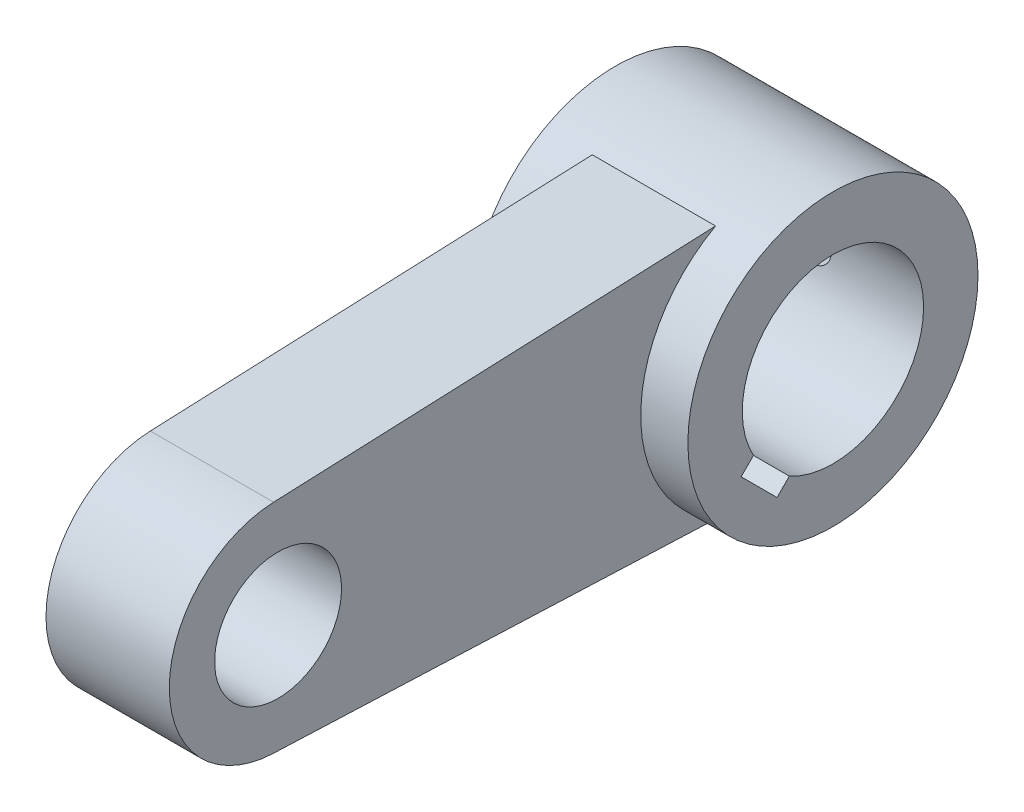
ISO-10303-21;
HEADER;
FILE_DESCRIPTION(('STEP AP214'),'2;1');
FILE_NAME('part.step','',(''),(''),'','','');
FILE_SCHEMA(('AUTOMOTIVE_DESIGN { 1 0 10303 214 1 1 1 1 }'));
ENDSEC;
DATA;
#1=APPLICATION_CONTEXT('core data for automotive mechanical design processes');
#2=APPLICATION_PROTOCOL_DEFINITION('international standard','automotive_design',2000,#1);
#3=PRODUCT_CONTEXT('',#1,'mechanical');
#4=PRODUCT('Part','Part','',(#3));
#5=PRODUCT_RELATED_PRODUCT_CATEGORY('part','',(#4));
#6=PRODUCT_DEFINITION_FORMATION('','',#4);
#7=PRODUCT_DEFINITION_CONTEXT('part definition',#1,'design');
#8=PRODUCT_DEFINITION('design','',#6,#7);
#9=PRODUCT_DEFINITION_SHAPE('','',#8);
#10=(LENGTH_UNIT() NAMED_UNIT(*) SI_UNIT(.MILLI.,.METRE.));
#11=(NAMED_UNIT(*) PLANE_ANGLE_UNIT() SI_UNIT($,.RADIAN.));
#12=(NAMED_UNIT(*) SI_UNIT($,.STERADIAN.) SOLID_ANGLE_UNIT());
#13=UNCERTAINTY_MEASURE_WITH_UNIT(LENGTH_MEASURE(1.E-05),#10,'distance_accuracy_value','');
#14=(GEOMETRIC_REPRESENTATION_CONTEXT(3) GLOBAL_UNCERTAINTY_ASSIGNED_CONTEXT((#13)) GLOBAL_UNIT_ASSIGNED_CONTEXT((#10,
#11,#12)) REPRESENTATION_CONTEXT('',''));
#15=CARTESIAN_POINT('',(0.,0.,0.));
#16=DIRECTION('',(0.,0.,1.));
#17=DIRECTION('',(1.,0.,0.));
#18=AXIS2_PLACEMENT_3D('',#15,#16,#17);
#19=CARTESIAN_POINT('',(30.,0.,0.));
#20=DIRECTION('',(-1.,0.,0.));
#21=DIRECTION('',(0.,0.,1.));
#22=AXIS2_PLACEMENT_3D('',#19,#20,#21);
#23=CYLINDRICAL_SURFACE('',#22,25.);
#24=DIRECTION('',(-1.,0.,0.));
#25=VECTOR('',#24,1.);
#26=CARTESIAN_POINT('',(30.,-21.920310216783,12.0208152801713));
#27=LINE('',#26,#25);
#28=CARTESIAN_POINT('',(30.,-21.920310216783,12.0208152801713));
#29=VERTEX_POINT('',#28);
#30=CARTESIAN_POINT('',(-30.,-21.920310216783,12.0208152801713));
#31=VERTEX_POINT('',#30);
#32=EDGE_CURVE('E11',#29,#31,#27,.T.);
#33=ORIENTED_EDGE('',*,*,#32,.F.);
#34=CARTESIAN_POINT('',(30.,0.,0.));
#35=DIRECTION('',(1.,0.,0.));
#36=DIRECTION('',(0.,0.,-1.));
#37=AXIS2_PLACEMENT_3D('',#34,#35,#36);
#38=CIRCLE('',#37,25.);
#39=CARTESIAN_POINT('',(30.,-12.0208152801714,21.920310216783));
#40=VERTEX_POINT('',#39);
#41=EDGE_CURVE('E194',#29,#40,#38,.T.);
#42=ORIENTED_EDGE('',*,*,#41,.T.);
#43=DIRECTION('',(-1.,0.,0.));
#44=VECTOR('',#43,1.);
#45=CARTESIAN_POINT('',(30.,-12.0208152801714,21.920310216783));
#46=LINE('',#45,#44);
#47=CARTESIAN_POINT('',(-30.,-12.0208152801714,21.9203102167829));
#48=VERTEX_POINT('',#47);
#49=EDGE_CURVE('E54',#48,#40,#46,.F.);
#50=ORIENTED_EDGE('',*,*,#49,.F.);
#51=CARTESIAN_POINT('',(-30.,0.,0.));
#52=DIRECTION('',(1.,0.,0.));
#53=DIRECTION('',(0.,0.,-1.));
#54=AXIS2_PLACEMENT_3D('',#51,#52,#53);
#55=CIRCLE('',#54,25.);
#56=EDGE_CURVE('E131',#31,#48,#55,.T.);
#57=ORIENTED_EDGE('',*,*,#56,.F.);
#58=EDGE_LOOP('',(#33,#42,#50,#57));
#59=FACE_BOUND('',#58,.T.);
#60=CARTESIAN_POINT('',(-4.5,0.,-25.));
#61=CARTESIAN_POINT('',(-4.49999023794724,0.250597363973599,-24.9999955349824));
#62=CARTESIAN_POINT('',(-4.47899625537845,0.501323876917189,-24.9961930246658));
#63=CARTESIAN_POINT('',(-4.39562192968987,0.995723957330813,-24.9813904308185));
#64=CARTESIAN_POINT('',(-4.3332054899993,1.23939117970386,-24.9703840697862));
#65=CARTESIAN_POINT('',(-4.16894916310287,1.71244999616223,-24.9424062116718));
#66=CARTESIAN_POINT('',(-4.06714363575236,1.9418538305925,-24.9254399147403));
#67=CARTESIAN_POINT('',(-3.82709380352833,2.38030017518678,-24.8873996423389));
#68=CARTESIAN_POINT('',(-3.68885289902246,2.58934458292246,-24.8663260502343));
#69=CARTESIAN_POINT('',(-3.3782296875251,2.98347784104024,-24.8221399679868));
#70=CARTESIAN_POINT('',(-3.20552232290177,3.16830850004194,-24.7990093268507));
#71=CARTESIAN_POINT('',(-2.83156816138721,3.50653520488897,-24.7534523836025));
#72=CARTESIAN_POINT('',(-2.63031941200501,3.65992909841612,-24.7310261298053));
#73=CARTESIAN_POINT('',(-2.20318937983302,3.9319873899253,-24.6892410288132));
#74=CARTESIAN_POINT('',(-1.97714004226101,4.0503918562218,-24.6699056064479));
#75=CARTESIAN_POINT('',(-1.50795273724954,4.24744691783923,-24.6367457883014));
#76=CARTESIAN_POINT('',(-1.26481612489624,4.32610066150121,-24.6229209560882));
#77=CARTESIAN_POINT('',(-0.771109385193302,4.44059853206701,-24.6025296249144));
#78=CARTESIAN_POINT('',(-0.520646504029352,4.47689129643564,-24.595887115759));
#79=CARTESIAN_POINT('',(-0.0171050046733867,4.50702896793618,-24.5903830912277));
#80=CARTESIAN_POINT('',(0.235973395787884,4.50087738040681,-24.5915209332983));
#81=CARTESIAN_POINT('',(0.734329570898184,4.44666536597975,-24.6013797705314));
#82=CARTESIAN_POINT('',(0.979664673316094,4.39911277131185,-24.6100088728769));
#83=CARTESIAN_POINT('',(1.45881687055287,4.26424730205573,-24.63373379911));
#84=CARTESIAN_POINT('',(1.69263351048955,4.17693285860231,-24.6488298781609));
#85=CARTESIAN_POINT('',(2.14361028624316,3.9645188236012,-24.6838850704582));
#86=CARTESIAN_POINT('',(2.36067067050962,3.83921201164645,-24.7038707343535));
#87=CARTESIAN_POINT('',(2.77087600628489,3.55451700057605,-24.7464353447752));
#88=CARTESIAN_POINT('',(2.96401871256649,3.39512560565797,-24.7690145343811));
#89=CARTESIAN_POINT('',(3.32384227379376,3.04403715860642,-24.8146237678444));
#90=CARTESIAN_POINT('',(3.49009887265454,2.85190522880331,-24.8376556021255));
#91=CARTESIAN_POINT('',(3.78808180669696,2.44225060557958,-24.881273529755));
#92=CARTESIAN_POINT('',(3.91980784519208,2.2247276940229,-24.9018596020886));
#93=CARTESIAN_POINT('',(4.14504397125817,1.77003953774169,-24.9383032656858));
#94=CARTESIAN_POINT('',(4.23851241690939,1.53285322593544,-24.9541556995184));
#95=CARTESIAN_POINT('',(4.38416438602457,1.04579850607947,-24.9793055791382));
#96=CARTESIAN_POINT('',(4.43635194625771,0.795931340606712,-24.9886036658512));
#97=CARTESIAN_POINT('',(4.49737595980626,0.294260216988702,-24.9995098648126));
#98=CARTESIAN_POINT('',(4.50679412042045,0.0425291868626924,-25.0012211575048));
#99=CARTESIAN_POINT('',(4.48356880794404,-0.458911723409039,-24.9970450682725));
#100=CARTESIAN_POINT('',(4.45092723320147,-0.708621694262525,-24.9911580292954));
#101=CARTESIAN_POINT('',(4.3449927666636,-1.19710504925386,-24.9725108511794));
#102=CARTESIAN_POINT('',(4.27199185315769,-1.43594380194823,-24.9598000968948));
#103=CARTESIAN_POINT('',(4.08772514305909,-1.8979925718465,-24.9289247642723));
#104=CARTESIAN_POINT('',(3.97645691054883,-2.12120159304627,-24.9107598387568));
#105=CARTESIAN_POINT('',(3.71750990184803,-2.54815393884932,-24.8707339593877));
#106=CARTESIAN_POINT('',(3.56947271887178,-2.75167647822448,-24.8488373327329));
#107=CARTESIAN_POINT('',(3.24167799765414,-3.13119917221303,-24.8038743164273));
#108=CARTESIAN_POINT('',(3.06191774493283,-3.30719696915623,-24.7808078267941));
#109=CARTESIAN_POINT('',(2.67315500182631,-3.62886457227507,-24.7357657200145));
#110=CARTESIAN_POINT('',(2.46382297755346,-3.77413883025331,-24.7138068137446));
#111=CARTESIAN_POINT('',(2.0233846981458,-4.02746147197305,-24.6737931763475));
#112=CARTESIAN_POINT('',(1.79227921149041,-4.1355111689036,-24.6557383075041));
#113=CARTESIAN_POINT('',(1.31589632776009,-4.31074517708663,-24.625706003715));
#114=CARTESIAN_POINT('',(1.07068958451153,-4.37811658335141,-24.6137007869683));
#115=CARTESIAN_POINT('',(0.572202641973279,-4.470663283678,-24.5970611969283));
#116=CARTESIAN_POINT('',(0.318923277225497,-4.4958429251693,-24.5924260642259));
#117=CARTESIAN_POINT('',(-0.184561947418673,-4.50315482559001,-24.5910878378625));
#118=CARTESIAN_POINT('',(-0.434758663309364,-4.48591048444909,-24.5942698737029));
#119=CARTESIAN_POINT('',(-0.928626221595354,-4.41022247631822,-24.6079538411193));
#120=CARTESIAN_POINT('',(-1.17229709592797,-4.35177901099412,-24.6184557368654));
#121=CARTESIAN_POINT('',(-1.64589578423665,-4.19560591177254,-24.6455494917391));
#122=CARTESIAN_POINT('',(-1.87584475423245,-4.09793864892305,-24.662131678772));
#123=CARTESIAN_POINT('',(-2.31619323333666,-3.86615687487561,-24.6995253290601));
#124=CARTESIAN_POINT('',(-2.52659151135305,-3.73204007056229,-24.7203370583837));
#125=CARTESIAN_POINT('',(-2.92499910875623,-3.42897741944008,-24.7642042764878));
#126=CARTESIAN_POINT('',(-3.1126589480834,-3.2595759827768,-24.7872867920529));
#127=CARTESIAN_POINT('',(-3.45709859905684,-2.89170727952952,-24.8328876755423));
#128=CARTESIAN_POINT('',(-3.61387129988846,-2.69323333818786,-24.8554059125196));
#129=CARTESIAN_POINT('',(-3.89327881529926,-2.27090824238867,-24.8975568201724));
#130=CARTESIAN_POINT('',(-4.01562311176295,-2.04686231241926,-24.9171643109947));
#131=CARTESIAN_POINT('',(-4.22074281003121,-1.58112288437946,-24.951039224399));
#132=CARTESIAN_POINT('',(-4.30355622072278,-1.33944659673402,-24.9653117736424));
#133=CARTESIAN_POINT('',(-4.41001277594757,-0.914142661867406,-24.9839218868527));
#134=CARTESIAN_POINT('',(-4.44370168771491,-0.733035393798855,-24.9899178167023));
#135=CARTESIAN_POINT('',(-4.48869863631085,-0.367975256206721,-24.9979584689488));
#136=CARTESIAN_POINT('',(-4.50000716861835,-0.184022449771341,-25.0000032788193));
#137=CARTESIAN_POINT('',(-4.5,0.,-25.));
#138=B_SPLINE_CURVE_WITH_KNOTS('',3,(#60,#61,#62,#63,#64,#65,#66,#67,#68,#69,#70,#71,#72,#73,
#74,#75,#76,#77,#78,#79,#80,#81,#82,#83,#84,#85,#86,#87,#88,#89,#90,#91,#92,#93,#94,#95,#96,#97,
#98,#99,#100,#101,#102,#103,#104,#105,#106,#107,#108,#109,#110,#111,#112,#113,#114,#115,#116,
#117,#118,#119,#120,#121,#122,#123,#124,#125,#126,#127,#128,#129,#130,#131,#132,#133,#134,#135,
#136,#137),.UNSPECIFIED.,.T.,.F.,(4,2,2,2,2,2,2,2,2,2,2,2,2,2,2,2,2,2,2,2,2,2,2,2,2,2,2,2,2,2,2,
2,2,2,2,2,2,2,4),(0.,0.751119234214512,1.50289387360229,2.25401419876758,3.00506444969103,
3.76356460982702,4.52211668334152,5.28616990310778,6.05016259876061,6.80598838145023,
7.56175174373442,8.30837334117056,9.05502440026869,9.80582347634745,10.5566929789408,
11.3184489414851,12.0802114488208,12.8428009144685,13.6053157989071,14.3574280220778,
15.1095063001765,15.8562135718353,16.6029683841676,17.3573093811478,18.1117149569104,
18.8753101422374,19.6388783870845,20.3989073934055,21.1588580817001,21.9077085429232,
22.6565553386193,23.4042160535922,24.1519238163261,24.9099617237503,25.6681739427107,
26.4326044530477,27.1962984767,27.7478839346366,28.2994571808942),.UNSPECIFIED.);
#139=CARTESIAN_POINT('',(-4.5,0.,-25.));
#140=VERTEX_POINT('',#139);
#141=EDGE_CURVE('E43',#140,#140,#138,.T.);
#142=ORIENTED_EDGE('',*,*,#141,.T.);
#143=EDGE_LOOP('',(#142));
#144=FACE_BOUND('',#143,.T.);
#145=ADVANCED_FACE('F39',(#59,#144),#23,.F.);
#146=CARTESIAN_POINT('',(30.,0.,0.));
#147=DIRECTION('',(1.,0.,0.));
#148=DIRECTION('',(0.,0.,-1.));
#149=AXIS2_PLACEMENT_3D('',#146,#147,#148);
#150=PLANE('',#149);
#151=DIRECTION('',(0.,0.707106781186549,-0.707106781186546));
#152=VECTOR('',#151,1.);
#153=CARTESIAN_POINT('',(30.,-3.70285616152566,-6.19663877508598));
#154=LINE('',#153,#152);
#155=CARTESIAN_POINT('',(30.,-25.3144227664784,15.4149278298667));
#156=VERTEX_POINT('',#155);
#157=EDGE_CURVE('E133',#156,#29,#154,.T.);
#158=ORIENTED_EDGE('',*,*,#157,.F.);
#159=DIRECTION('',(0.,-0.707106781186546,-0.707106781186549));
#160=VECTOR('',#159,1.);
#161=CARTESIAN_POINT('',(30.,-15.4149278298668,25.3144227664784));
#162=LINE('',#161,#160);
#163=CARTESIAN_POINT('',(30.,-15.4149278298668,25.3144227664784));
#164=VERTEX_POINT('',#163);
#165=EDGE_CURVE('E136',#164,#156,#162,.T.);
#166=ORIENTED_EDGE('',*,*,#165,.F.);
#167=DIRECTION('',(0.,-0.707106781186549,0.707106781186546));
#168=VECTOR('',#167,1.);
#169=CARTESIAN_POINT('',(30.,6.19663877508597,3.70285616152568));
#170=LINE('',#169,#168);
#171=EDGE_CURVE('E112',#40,#164,#170,.T.);
#172=ORIENTED_EDGE('',*,*,#171,.F.);
#173=ORIENTED_EDGE('',*,*,#41,.F.);
#174=EDGE_LOOP('',(#158,#166,#172,#173));
#175=FACE_BOUND('',#174,.T.);
#176=CARTESIAN_POINT('',(30.,0.,0.));
#177=DIRECTION('',(1.,0.,0.));
#178=DIRECTION('',(0.,0.,-1.));
#179=AXIS2_PLACEMENT_3D('',#176,#177,#178);
#180=CIRCLE('',#179,40.);
#181=CARTESIAN_POINT('',(30.,0.,-40.));
#182=VERTEX_POINT('',#181);
#183=EDGE_CURVE('E201',#182,#182,#180,.T.);
#184=ORIENTED_EDGE('',*,*,#183,.T.);
#185=EDGE_LOOP('',(#184));
#186=FACE_BOUND('',#185,.T.);
#187=ADVANCED_FACE('F216',(#175,#186),#150,.T.);
#188=CARTESIAN_POINT('',(-30.,0.,0.));
#189=DIRECTION('',(1.,0.,0.));
#190=DIRECTION('',(0.,0.,-1.));
#191=AXIS2_PLACEMENT_3D('',#188,#189,#190);
#192=PLANE('',#191);
#193=CARTESIAN_POINT('',(-30.,0.,0.));
#194=DIRECTION('',(1.,0.,0.));
#195=DIRECTION('',(0.,0.,-1.));
#196=AXIS2_PLACEMENT_3D('',#193,#194,#195);
#197=CIRCLE('',#196,40.);
#198=CARTESIAN_POINT('',(-30.,0.,-40.));
#199=VERTEX_POINT('',#198);
#200=EDGE_CURVE('E198',#199,#199,#197,.T.);
#201=ORIENTED_EDGE('',*,*,#200,.F.);
#202=EDGE_LOOP('',(#201));
#203=FACE_BOUND('',#202,.T.);
#204=DIRECTION('',(0.,-0.707106781186546,-0.707106781186549));
#205=VECTOR('',#204,1.);
#206=CARTESIAN_POINT('',(-30.,-15.4149278298668,25.3144227664784));
#207=LINE('',#206,#205);
#208=CARTESIAN_POINT('',(-30.,-15.4149278298668,25.3144227664784));
#209=VERTEX_POINT('',#208);
#210=CARTESIAN_POINT('',(-30.,-25.3144227664784,15.4149278298667));
#211=VERTEX_POINT('',#210);
#212=EDGE_CURVE('E121',#209,#211,#207,.T.);
#213=ORIENTED_EDGE('',*,*,#212,.T.);
#214=DIRECTION('',(0.,0.707106781186549,-0.707106781186546));
#215=VECTOR('',#214,1.);
#216=CARTESIAN_POINT('',(-30.,-3.70285616152566,-6.19663877508598));
#217=LINE('',#216,#215);
#218=EDGE_CURVE('E118',#211,#31,#217,.T.);
#219=ORIENTED_EDGE('',*,*,#218,.T.);
#220=ORIENTED_EDGE('',*,*,#56,.T.);
#221=DIRECTION('',(0.,-0.707106781186549,0.707106781186546));
#222=VECTOR('',#221,1.);
#223=CARTESIAN_POINT('',(-30.,6.19663877508597,3.70285616152568));
#224=LINE('',#223,#222);
#225=EDGE_CURVE('E61',#48,#209,#224,.T.);
#226=ORIENTED_EDGE('',*,*,#225,.T.);
#227=EDGE_LOOP('',(#213,#219,#220,#226));
#228=FACE_BOUND('',#227,.T.);
#229=ADVANCED_FACE('F129',(#203,#228),#192,.F.);
#230=CARTESIAN_POINT('',(30.,0.,0.));
#231=DIRECTION('',(-1.,0.,0.));
#232=DIRECTION('',(0.,0.,1.));
#233=AXIS2_PLACEMENT_3D('',#230,#231,#232);
#234=CYLINDRICAL_SURFACE('',#233,40.);
#235=DIRECTION('',(-1.,0.,0.));
#236=VECTOR('',#235,1.);
#237=CARTESIAN_POINT('',(17.,35.,19.3649167310371));
#238=LINE('',#237,#236);
#239=CARTESIAN_POINT('',(17.,35.,19.3649167310371));
#240=VERTEX_POINT('',#239);
#241=CARTESIAN_POINT('',(-17.,35.,19.3649167310371));
#242=VERTEX_POINT('',#241);
#243=EDGE_CURVE('E69',#240,#242,#238,.T.);
#244=ORIENTED_EDGE('',*,*,#243,.F.);
#245=CARTESIAN_POINT('',(17.,0.,0.));
#246=DIRECTION('',(-1.,0.,0.));
#247=DIRECTION('',(0.,0.,-1.));
#248=AXIS2_PLACEMENT_3D('',#245,#246,#247);
#249=CIRCLE('',#248,40.);
#250=CARTESIAN_POINT('',(17.,-35.,19.3649167310371));
#251=VERTEX_POINT('',#250);
#252=EDGE_CURVE('E154',#251,#240,#249,.T.);
#253=ORIENTED_EDGE('',*,*,#252,.F.);
#254=DIRECTION('',(-1.,0.,0.));
#255=VECTOR('',#254,1.);
#256=CARTESIAN_POINT('',(17.,-35.,19.3649167310371));
#257=LINE('',#256,#255);
#258=CARTESIAN_POINT('',(-17.,-35.,19.3649167310371));
#259=VERTEX_POINT('',#258);
#260=EDGE_CURVE('E169',#251,#259,#257,.T.);
#261=ORIENTED_EDGE('',*,*,#260,.T.);
#262=CARTESIAN_POINT('',(-17.,0.,0.));
#263=DIRECTION('',(-1.,0.,0.));
#264=DIRECTION('',(0.,0.,-1.));
#265=AXIS2_PLACEMENT_3D('',#262,#263,#264);
#266=CIRCLE('',#265,40.);
#267=EDGE_CURVE('E170',#259,#242,#266,.T.);
#268=ORIENTED_EDGE('',*,*,#267,.T.);
#269=EDGE_LOOP('',(#244,#253,#261,#268));
#270=FACE_BOUND('',#269,.T.);
#271=ORIENTED_EDGE('',*,*,#183,.F.);
#272=EDGE_LOOP('',(#271));
#273=FACE_BOUND('',#272,.T.);
#274=ORIENTED_EDGE('',*,*,#200,.T.);
#275=EDGE_LOOP('',(#274));
#276=FACE_BOUND('',#275,.T.);
#277=ADVANCED_FACE('F41',(#270,#273,#276),#234,.T.);
#278=CARTESIAN_POINT('',(17.,35.,19.3649167310371));
#279=DIRECTION('',(0.,-0.999150880094501,-0.04120095637706));
#280=DIRECTION('',(0.,0.04120095637706,-0.999150880094501));
#281=AXIS2_PLACEMENT_3D('',#278,#279,#280);
#282=PLANE('',#281);
#283=DIRECTION('',(0.,-0.04120095637706,0.999150880094501));
#284=VECTOR('',#283,1.);
#285=CARTESIAN_POINT('',(-17.,35.,19.3649167310371));
#286=LINE('',#285,#284);
#287=CARTESIAN_POINT('',(-17.,29.974526402835,141.236028691312));
#288=VERTEX_POINT('',#287);
#289=EDGE_CURVE('E173',#242,#288,#286,.T.);
#290=ORIENTED_EDGE('',*,*,#289,.T.);
#291=DIRECTION('',(-1.,0.,0.));
#292=VECTOR('',#291,1.);
#293=CARTESIAN_POINT('',(17.,29.974526402835,141.236028691312));
#294=LINE('',#293,#292);
#295=CARTESIAN_POINT('',(17.,29.974526402835,141.236028691312));
#296=VERTEX_POINT('',#295);
#297=EDGE_CURVE('E188',#296,#288,#294,.T.);
#298=ORIENTED_EDGE('',*,*,#297,.F.);
#299=DIRECTION('',(0.,-0.04120095637706,0.999150880094501));
#300=VECTOR('',#299,1.);
#301=CARTESIAN_POINT('',(17.,35.,19.3649167310371));
#302=LINE('',#301,#300);
#303=EDGE_CURVE('E158',#240,#296,#302,.T.);
#304=ORIENTED_EDGE('',*,*,#303,.F.);
#305=ORIENTED_EDGE('',*,*,#243,.T.);
#306=EDGE_LOOP('',(#290,#298,#304,#305));
#307=FACE_BOUND('',#306,.T.);
#308=ADVANCED_FACE('F240',(#307),#282,.F.);
#309=CARTESIAN_POINT('',(17.,0.,140.));
#310=DIRECTION('',(-1.,0.,0.));
#311=DIRECTION('',(0.,0.,1.));
#312=AXIS2_PLACEMENT_3D('',#309,#310,#311);
#313=CYLINDRICAL_SURFACE('',#312,30.);
#314=CARTESIAN_POINT('',(-17.,0.,140.));
#315=DIRECTION('',(1.,0.,0.));
#316=DIRECTION('',(0.,0.,-1.));
#317=AXIS2_PLACEMENT_3D('',#314,#315,#316);
#318=CIRCLE('',#317,30.);
#319=CARTESIAN_POINT('',(-17.,-29.974526402835,141.236028691312));
#320=VERTEX_POINT('',#319);
#321=EDGE_CURVE('E176',#288,#320,#318,.T.);
#322=ORIENTED_EDGE('',*,*,#321,.T.);
#323=DIRECTION('',(-1.,0.,0.));
#324=VECTOR('',#323,1.);
#325=CARTESIAN_POINT('',(17.,-29.974526402835,141.236028691312));
#326=LINE('',#325,#324);
#327=CARTESIAN_POINT('',(17.,-29.974526402835,141.236028691312));
#328=VERTEX_POINT('',#327);
#329=EDGE_CURVE('E184',#328,#320,#326,.T.);
#330=ORIENTED_EDGE('',*,*,#329,.F.);
#331=CARTESIAN_POINT('',(17.,0.,140.));
#332=DIRECTION('',(1.,0.,0.));
#333=DIRECTION('',(0.,0.,-1.));
#334=AXIS2_PLACEMENT_3D('',#331,#332,#333);
#335=CIRCLE('',#334,30.);
#336=EDGE_CURVE('E162',#296,#328,#335,.T.);
#337=ORIENTED_EDGE('',*,*,#336,.F.);
#338=ORIENTED_EDGE('',*,*,#297,.T.);
#339=EDGE_LOOP('',(#322,#330,#337,#338));
#340=FACE_BOUND('',#339,.T.);
#341=ADVANCED_FACE('F252',(#340),#313,.T.);
#342=CARTESIAN_POINT('',(17.,-29.974526402835,141.236028691312));
#343=DIRECTION('',(0.,0.999150880094501,-0.04120095637706));
#344=DIRECTION('',(0.,0.04120095637706,0.999150880094501));
#345=AXIS2_PLACEMENT_3D('',#342,#343,#344);
#346=PLANE('',#345);
#347=DIRECTION('',(0.,-0.04120095637706,-0.999150880094501));
#348=VECTOR('',#347,1.);
#349=CARTESIAN_POINT('',(-17.,-29.974526402835,141.236028691312));
#350=LINE('',#349,#348);
#351=EDGE_CURVE('E159',#320,#259,#350,.T.);
#352=ORIENTED_EDGE('',*,*,#351,.T.);
#353=ORIENTED_EDGE('',*,*,#260,.F.);
#354=DIRECTION('',(0.,-0.04120095637706,-0.999150880094501));
#355=VECTOR('',#354,1.);
#356=CARTESIAN_POINT('',(17.,-29.974526402835,141.236028691312));
#357=LINE('',#356,#355);
#358=EDGE_CURVE('E165',#328,#251,#357,.T.);
#359=ORIENTED_EDGE('',*,*,#358,.F.);
#360=ORIENTED_EDGE('',*,*,#329,.T.);
#361=EDGE_LOOP('',(#352,#353,#359,#360));
#362=FACE_BOUND('',#361,.T.);
#363=ADVANCED_FACE('F259',(#362),#346,.F.);
#364=CARTESIAN_POINT('',(17.,0.,0.));
#365=DIRECTION('',(1.,0.,0.));
#366=DIRECTION('',(0.,0.,-1.));
#367=AXIS2_PLACEMENT_3D('',#364,#365,#366);
#368=PLANE('',#367);
#369=CARTESIAN_POINT('',(17.,0.,140.));
#370=DIRECTION('',(1.,0.,0.));
#371=DIRECTION('',(0.,0.,-1.));
#372=AXIS2_PLACEMENT_3D('',#369,#370,#371);
#373=CIRCLE('',#372,17.5);
#374=CARTESIAN_POINT('',(17.,0.,122.5));
#375=VERTEX_POINT('',#374);
#376=EDGE_CURVE('E148',#375,#375,#373,.T.);
#377=ORIENTED_EDGE('',*,*,#376,.F.);
#378=EDGE_LOOP('',(#377));
#379=FACE_BOUND('',#378,.T.);
#380=ORIENTED_EDGE('',*,*,#252,.T.);
#381=ORIENTED_EDGE('',*,*,#303,.T.);
#382=ORIENTED_EDGE('',*,*,#336,.T.);
#383=ORIENTED_EDGE('',*,*,#358,.T.);
#384=EDGE_LOOP('',(#380,#381,#382,#383));
#385=FACE_BOUND('',#384,.T.);
#386=ADVANCED_FACE('F273',(#379,#385),#368,.T.);
#387=CARTESIAN_POINT('',(-17.,0.,0.));
#388=DIRECTION('',(1.,0.,0.));
#389=DIRECTION('',(0.,0.,-1.));
#390=AXIS2_PLACEMENT_3D('',#387,#388,#389);
#391=PLANE('',#390);
#392=CARTESIAN_POINT('',(-17.,0.,140.));
#393=DIRECTION('',(1.,0.,0.));
#394=DIRECTION('',(0.,0.,-1.));
#395=AXIS2_PLACEMENT_3D('',#392,#393,#394);
#396=CIRCLE('',#395,17.5);
#397=CARTESIAN_POINT('',(-17.,0.,122.5));
#398=VERTEX_POINT('',#397);
#399=EDGE_CURVE('E153',#398,#398,#396,.T.);
#400=ORIENTED_EDGE('',*,*,#399,.T.);
#401=EDGE_LOOP('',(#400));
#402=FACE_BOUND('',#401,.T.);
#403=ORIENTED_EDGE('',*,*,#267,.F.);
#404=ORIENTED_EDGE('',*,*,#351,.F.);
#405=ORIENTED_EDGE('',*,*,#321,.F.);
#406=ORIENTED_EDGE('',*,*,#289,.F.);
#407=EDGE_LOOP('',(#403,#404,#405,#406));
#408=FACE_BOUND('',#407,.T.);
#409=ADVANCED_FACE('F230',(#402,#408),#391,.F.);
#410=CARTESIAN_POINT('',(-30.,0.,140.));
#411=DIRECTION('',(1.,0.,0.));
#412=DIRECTION('',(0.,0.,-1.));
#413=AXIS2_PLACEMENT_3D('',#410,#411,#412);
#414=CYLINDRICAL_SURFACE('',#413,17.5);
#415=ORIENTED_EDGE('',*,*,#376,.T.);
#416=EDGE_LOOP('',(#415));
#417=FACE_BOUND('',#416,.T.);
#418=ORIENTED_EDGE('',*,*,#399,.F.);
#419=EDGE_LOOP('',(#418));
#420=FACE_BOUND('',#419,.T.);
#421=ADVANCED_FACE('F223',(#417,#420),#414,.F.);
#422=CARTESIAN_POINT('',(-30.,-3.70285616152566,-6.19663877508598));
#423=DIRECTION('',(0.,-0.707106781186546,-0.707106781186549));
#424=DIRECTION('',(0.,0.707106781186549,-0.707106781186546));
#425=AXIS2_PLACEMENT_3D('',#422,#423,#424);
#426=PLANE('',#425);
#427=ORIENTED_EDGE('',*,*,#32,.T.);
#428=ORIENTED_EDGE('',*,*,#218,.F.);
#429=DIRECTION('',(1.,0.,0.));
#430=VECTOR('',#429,1.);
#431=CARTESIAN_POINT('',(-30.,-25.3144227664784,15.4149278298667));
#432=LINE('',#431,#430);
#433=EDGE_CURVE('E117',#211,#156,#432,.T.);
#434=ORIENTED_EDGE('',*,*,#433,.T.);
#435=ORIENTED_EDGE('',*,*,#157,.T.);
#436=EDGE_LOOP('',(#427,#428,#434,#435));
#437=FACE_BOUND('',#436,.T.);
#438=ADVANCED_FACE('F221',(#437),#426,.F.);
#439=CARTESIAN_POINT('',(-30.,-15.4149278298668,25.3144227664784));
#440=DIRECTION('',(0.,-0.707106781186549,0.707106781186546));
#441=DIRECTION('',(0.,-0.707106781186546,-0.707106781186549));
#442=AXIS2_PLACEMENT_3D('',#439,#440,#441);
#443=PLANE('',#442);
#444=ORIENTED_EDGE('',*,*,#165,.T.);
#445=ORIENTED_EDGE('',*,*,#433,.F.);
#446=ORIENTED_EDGE('',*,*,#212,.F.);
#447=DIRECTION('',(1.,0.,0.));
#448=VECTOR('',#447,1.);
#449=CARTESIAN_POINT('',(-30.,-15.4149278298668,25.3144227664784));
#450=LINE('',#449,#448);
#451=EDGE_CURVE('E108',#209,#164,#450,.T.);
#452=ORIENTED_EDGE('',*,*,#451,.T.);
#453=EDGE_LOOP('',(#444,#445,#446,#452));
#454=FACE_BOUND('',#453,.T.);
#455=ADVANCED_FACE('F122',(#454),#443,.F.);
#456=CARTESIAN_POINT('',(-30.,6.19663877508597,3.70285616152568));
#457=DIRECTION('',(0.,0.707106781186546,0.707106781186549));
#458=DIRECTION('',(0.,-0.707106781186549,0.707106781186546));
#459=AXIS2_PLACEMENT_3D('',#456,#457,#458);
#460=PLANE('',#459);
#461=ORIENTED_EDGE('',*,*,#49,.T.);
#462=ORIENTED_EDGE('',*,*,#171,.T.);
#463=ORIENTED_EDGE('',*,*,#451,.F.);
#464=ORIENTED_EDGE('',*,*,#225,.F.);
#465=EDGE_LOOP('',(#461,#462,#463,#464));
#466=FACE_BOUND('',#465,.T.);
#467=ADVANCED_FACE('F110',(#466),#460,.F.);
#468=CARTESIAN_POINT('',(0.,0.,-11.));
#469=DIRECTION('',(0.,0.,-1.));
#470=DIRECTION('',(-1.,0.,0.));
#471=AXIS2_PLACEMENT_3D('',#468,#469,#470);
#472=CYLINDRICAL_SURFACE('',#471,4.5);
#473=ORIENTED_EDGE('',*,*,#141,.F.);
#474=EDGE_LOOP('',(#473));
#475=FACE_BOUND('',#474,.T.);
#476=CARTESIAN_POINT('',(0.,0.,-35.));
#477=DIRECTION('',(0.,0.,1.));
#478=DIRECTION('',(1.,0.,0.));
#479=AXIS2_PLACEMENT_3D('',#476,#477,#478);
#480=CIRCLE('',#479,4.5);
#481=CARTESIAN_POINT('',(4.5,0.,-35.));
#482=VERTEX_POINT('',#481);
#483=EDGE_CURVE('E139',#482,#482,#480,.T.);
#484=ORIENTED_EDGE('',*,*,#483,.F.);
#485=EDGE_LOOP('',(#484));
#486=FACE_BOUND('',#485,.T.);
#487=ADVANCED_FACE('F287',(#475,#486),#472,.F.);
#488=CARTESIAN_POINT('',(0.,0.,-35.));
#489=DIRECTION('',(0.,0.,1.));
#490=DIRECTION('',(1.,0.,0.));
#491=AXIS2_PLACEMENT_3D('',#488,#489,#490);
#492=PLANE('',#491);
#493=ORIENTED_EDGE('',*,*,#483,.T.);
#494=EDGE_LOOP('',(#493));
#495=FACE_BOUND('',#494,.T.);
#496=ADVANCED_FACE('F291',(#495),#492,.T.);
#497=CLOSED_SHELL('',(#145,#187,#229,#277,#308,#341,#363,#386,#409,#421,#438,#455,#467,#487,#496));
#498=MANIFOLD_SOLID_BREP('B2',#497);
#499=ADVANCED_BREP_SHAPE_REPRESENTATION('',(#18,#498),#14);
#500=SHAPE_DEFINITION_REPRESENTATION(#9,#499);
ENDSEC;
END-ISO-10303-21;
